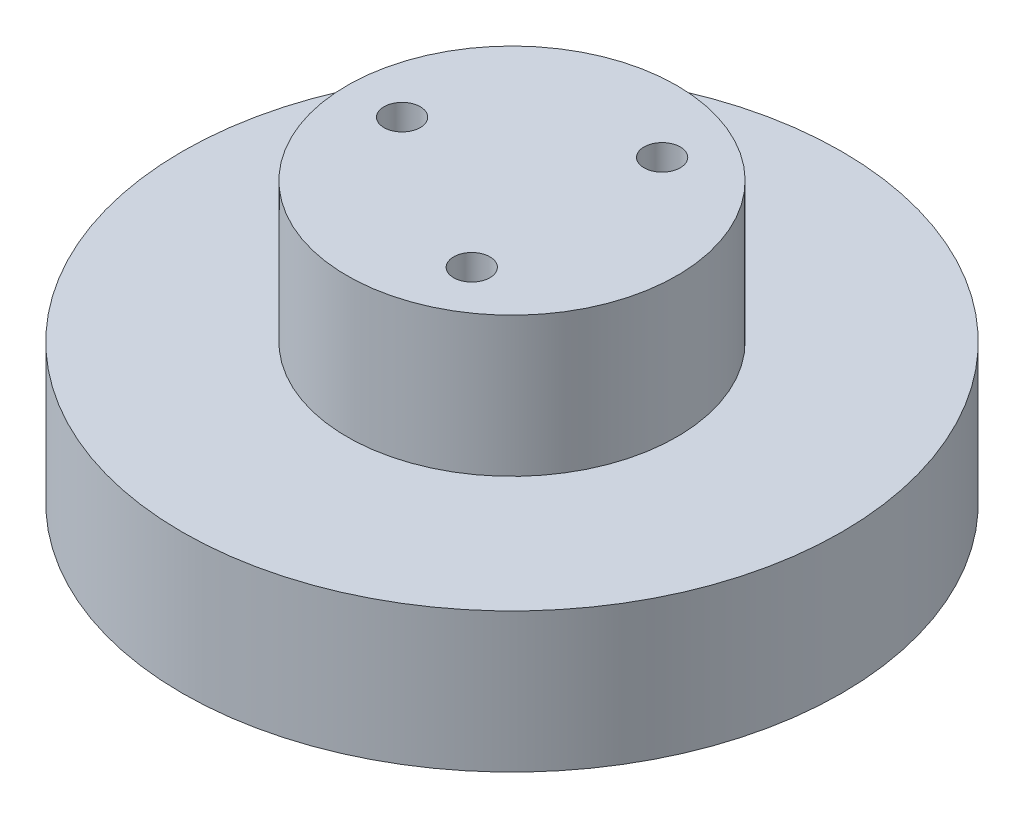
ISO-10303-21;
HEADER;
FILE_DESCRIPTION(('STEP AP214'),'2;1');
FILE_NAME('part.step','',(''),(''),'','','');
FILE_SCHEMA(('AUTOMOTIVE_DESIGN { 1 0 10303 214 1 1 1 1 }'));
ENDSEC;
DATA;
#1=APPLICATION_CONTEXT('core data for automotive mechanical design processes');
#2=APPLICATION_PROTOCOL_DEFINITION('international standard','automotive_design',2000,#1);
#3=PRODUCT_CONTEXT('',#1,'mechanical');
#4=PRODUCT('Part','Part','',(#3));
#5=PRODUCT_RELATED_PRODUCT_CATEGORY('part','',(#4));
#6=PRODUCT_DEFINITION_FORMATION('','',#4);
#7=PRODUCT_DEFINITION_CONTEXT('part definition',#1,'design');
#8=PRODUCT_DEFINITION('design','',#6,#7);
#9=PRODUCT_DEFINITION_SHAPE('','',#8);
#10=(LENGTH_UNIT() NAMED_UNIT(*) SI_UNIT(.MILLI.,.METRE.));
#11=(NAMED_UNIT(*) PLANE_ANGLE_UNIT() SI_UNIT($,.RADIAN.));
#12=(NAMED_UNIT(*) SI_UNIT($,.STERADIAN.) SOLID_ANGLE_UNIT());
#13=UNCERTAINTY_MEASURE_WITH_UNIT(LENGTH_MEASURE(1.E-05),#10,'distance_accuracy_value','');
#14=(GEOMETRIC_REPRESENTATION_CONTEXT(3) GLOBAL_UNCERTAINTY_ASSIGNED_CONTEXT((#13)) GLOBAL_UNIT_ASSIGNED_CONTEXT((#10,
#11,#12)) REPRESENTATION_CONTEXT('',''));
#15=CARTESIAN_POINT('',(0.,0.,0.));
#16=DIRECTION('',(0.,0.,1.));
#17=DIRECTION('',(1.,0.,0.));
#18=AXIS2_PLACEMENT_3D('',#15,#16,#17);
#19=CARTESIAN_POINT('',(0.,12.7,0.));
#20=DIRECTION('',(0.,-1.,0.));
#21=DIRECTION('',(0.,0.,-1.));
#22=AXIS2_PLACEMENT_3D('',#19,#20,#21);
#23=PLANE('',#22);
#24=CARTESIAN_POINT('',(4.99999999999998,12.7,-8.6602540378444));
#25=DIRECTION('',(0.,1.,0.));
#26=DIRECTION('',(0.,0.,1.));
#27=AXIS2_PLACEMENT_3D('',#24,#25,#26);
#28=CIRCLE('',#27,1.64999999999999);
#29=CARTESIAN_POINT('',(4.99999999999998,12.7,-7.01025403784441));
#30=VERTEX_POINT('',#29);
#31=EDGE_CURVE('E92',#30,#30,#28,.T.);
#32=ORIENTED_EDGE('',*,*,#31,.F.);
#33=EDGE_LOOP('',(#32));
#34=FACE_BOUND('',#33,.T.);
#35=CARTESIAN_POINT('',(5.00000000000004,12.7,8.66025403784436));
#36=DIRECTION('',(0.,1.,0.));
#37=DIRECTION('',(0.,0.,1.));
#38=AXIS2_PLACEMENT_3D('',#35,#36,#37);
#39=CIRCLE('',#38,1.64999999999999);
#40=CARTESIAN_POINT('',(5.00000000000004,12.7,10.3102540378444));
#41=VERTEX_POINT('',#40);
#42=EDGE_CURVE('E98',#41,#41,#39,.T.);
#43=ORIENTED_EDGE('',*,*,#42,.F.);
#44=EDGE_LOOP('',(#43));
#45=FACE_BOUND('',#44,.T.);
#46=CARTESIAN_POINT('',(-10.,12.7,0.));
#47=DIRECTION('',(0.,1.,0.));
#48=DIRECTION('',(0.,0.,1.));
#49=AXIS2_PLACEMENT_3D('',#46,#47,#48);
#50=CIRCLE('',#49,1.64999999999999);
#51=CARTESIAN_POINT('',(-10.,12.7,1.64999999999999));
#52=VERTEX_POINT('',#51);
#53=EDGE_CURVE('E104',#52,#52,#50,.T.);
#54=ORIENTED_EDGE('',*,*,#53,.F.);
#55=EDGE_LOOP('',(#54));
#56=FACE_BOUND('',#55,.T.);
#57=CARTESIAN_POINT('',(0.,12.7,0.));
#58=DIRECTION('',(0.,-1.,0.));
#59=DIRECTION('',(0.,0.,-1.));
#60=AXIS2_PLACEMENT_3D('',#57,#58,#59);
#61=CIRCLE('',#60,15.);
#62=CARTESIAN_POINT('',(0.,12.7,-15.));
#63=VERTEX_POINT('',#62);
#64=EDGE_CURVE('E11',#63,#63,#61,.T.);
#65=ORIENTED_EDGE('',*,*,#64,.F.);
#66=EDGE_LOOP('',(#65));
#67=FACE_BOUND('',#66,.T.);
#68=ADVANCED_FACE('F39',(#34,#45,#56,#67),#23,.F.);
#69=CARTESIAN_POINT('',(0.,-12.7,0.));
#70=DIRECTION('',(0.,-1.,0.));
#71=DIRECTION('',(0.,0.,-1.));
#72=AXIS2_PLACEMENT_3D('',#69,#70,#71);
#73=CYLINDRICAL_SURFACE('',#72,15.);
#74=CARTESIAN_POINT('',(0.,0.,0.));
#75=DIRECTION('',(0.,-1.,0.));
#76=DIRECTION('',(0.,0.,-1.));
#77=AXIS2_PLACEMENT_3D('',#74,#75,#76);
#78=CIRCLE('',#77,15.);
#79=CARTESIAN_POINT('',(0.,0.,-15.));
#80=VERTEX_POINT('',#79);
#81=EDGE_CURVE('E46',#80,#80,#78,.T.);
#82=ORIENTED_EDGE('',*,*,#81,.F.);
#83=EDGE_LOOP('',(#82));
#84=FACE_BOUND('',#83,.T.);
#85=ORIENTED_EDGE('',*,*,#64,.T.);
#86=EDGE_LOOP('',(#85));
#87=FACE_BOUND('',#86,.T.);
#88=ADVANCED_FACE('F120',(#84,#87),#73,.T.);
#89=CARTESIAN_POINT('',(-15.,0.,0.));
#90=DIRECTION('',(0.,-1.,0.));
#91=DIRECTION('',(0.,0.,-1.));
#92=AXIS2_PLACEMENT_3D('',#89,#90,#91);
#93=PLANE('',#92);
#94=CARTESIAN_POINT('',(0.,0.,0.));
#95=DIRECTION('',(0.,-1.,0.));
#96=DIRECTION('',(0.,0.,-1.));
#97=AXIS2_PLACEMENT_3D('',#94,#95,#96);
#98=CIRCLE('',#97,30.);
#99=CARTESIAN_POINT('',(0.,0.,-30.));
#100=VERTEX_POINT('',#99);
#101=EDGE_CURVE('E113',#100,#100,#98,.T.);
#102=ORIENTED_EDGE('',*,*,#101,.F.);
#103=EDGE_LOOP('',(#102));
#104=FACE_BOUND('',#103,.T.);
#105=ORIENTED_EDGE('',*,*,#81,.T.);
#106=EDGE_LOOP('',(#105));
#107=FACE_BOUND('',#106,.T.);
#108=ADVANCED_FACE('F118',(#104,#107),#93,.F.);
#109=CARTESIAN_POINT('',(0.,-12.7,0.));
#110=DIRECTION('',(0.,-1.,0.));
#111=DIRECTION('',(0.,0.,-1.));
#112=AXIS2_PLACEMENT_3D('',#109,#110,#111);
#113=CYLINDRICAL_SURFACE('',#112,30.);
#114=CARTESIAN_POINT('',(0.,-12.7,0.));
#115=DIRECTION('',(0.,-1.,0.));
#116=DIRECTION('',(0.,0.,-1.));
#117=AXIS2_PLACEMENT_3D('',#114,#115,#116);
#118=CIRCLE('',#117,30.);
#119=CARTESIAN_POINT('',(0.,-12.7,-30.));
#120=VERTEX_POINT('',#119);
#121=EDGE_CURVE('E110',#120,#120,#118,.T.);
#122=ORIENTED_EDGE('',*,*,#121,.F.);
#123=EDGE_LOOP('',(#122));
#124=FACE_BOUND('',#123,.T.);
#125=ORIENTED_EDGE('',*,*,#101,.T.);
#126=EDGE_LOOP('',(#125));
#127=FACE_BOUND('',#126,.T.);
#128=ADVANCED_FACE('F154',(#124,#127),#113,.T.);
#129=CARTESIAN_POINT('',(-30.,-12.7,0.));
#130=DIRECTION('',(0.,1.,0.));
#131=DIRECTION('',(0.,0.,1.));
#132=AXIS2_PLACEMENT_3D('',#129,#130,#131);
#133=PLANE('',#132);
#134=CARTESIAN_POINT('',(20.,-12.7,0.));
#135=DIRECTION('',(0.,-1.,0.));
#136=DIRECTION('',(0.,0.,-1.));
#137=AXIS2_PLACEMENT_3D('',#134,#135,#136);
#138=CIRCLE('',#137,1.64999999999999);
#139=CARTESIAN_POINT('',(20.,-12.7,-1.64999999999999));
#140=VERTEX_POINT('',#139);
#141=EDGE_CURVE('E76',#140,#140,#138,.T.);
#142=ORIENTED_EDGE('',*,*,#141,.F.);
#143=EDGE_LOOP('',(#142));
#144=FACE_BOUND('',#143,.T.);
#145=CARTESIAN_POINT('',(-9.99999999999996,-12.7,17.3205080756888));
#146=DIRECTION('',(0.,-1.,0.));
#147=DIRECTION('',(0.,0.,-1.));
#148=AXIS2_PLACEMENT_3D('',#145,#146,#147);
#149=CIRCLE('',#148,1.64999999999999);
#150=CARTESIAN_POINT('',(-9.99999999999996,-12.7,15.6705080756888));
#151=VERTEX_POINT('',#150);
#152=EDGE_CURVE('E75',#151,#151,#149,.T.);
#153=ORIENTED_EDGE('',*,*,#152,.F.);
#154=EDGE_LOOP('',(#153));
#155=FACE_BOUND('',#154,.T.);
#156=CARTESIAN_POINT('',(-9.99999999999996,-12.7,-17.3205080756888));
#157=DIRECTION('',(0.,-1.,0.));
#158=DIRECTION('',(0.,0.,-1.));
#159=AXIS2_PLACEMENT_3D('',#156,#157,#158);
#160=CIRCLE('',#159,1.64999999999999);
#161=CARTESIAN_POINT('',(-9.99999999999996,-12.7,-18.9705080756888));
#162=VERTEX_POINT('',#161);
#163=EDGE_CURVE('E86',#162,#162,#160,.T.);
#164=ORIENTED_EDGE('',*,*,#163,.F.);
#165=EDGE_LOOP('',(#164));
#166=FACE_BOUND('',#165,.T.);
#167=ORIENTED_EDGE('',*,*,#121,.T.);
#168=EDGE_LOOP('',(#167));
#169=FACE_BOUND('',#168,.T.);
#170=ADVANCED_FACE('F147',(#144,#155,#166,#169),#133,.F.);
#171=CARTESIAN_POINT('',(-10.,2.6,0.));
#172=DIRECTION('',(0.,1.,0.));
#173=DIRECTION('',(0.,0.,1.));
#174=AXIS2_PLACEMENT_3D('',#171,#172,#173);
#175=CONICAL_SURFACE('',#174,1.64999999999999,1.02974425867665);
#176=CARTESIAN_POINT('',(-10.,1.60857997860452,0.));
#177=VERTEX_POINT('',#176);
#178=VERTEX_LOOP('',#177);
#179=FACE_BOUND('',#178,.T.);
#180=CARTESIAN_POINT('',(-10.,2.6,0.));
#181=DIRECTION('',(0.,1.,0.));
#182=DIRECTION('',(0.,0.,1.));
#183=AXIS2_PLACEMENT_3D('',#180,#181,#182);
#184=CIRCLE('',#183,1.64999999999999);
#185=CARTESIAN_POINT('',(-10.,2.6,1.64999999999999));
#186=VERTEX_POINT('',#185);
#187=EDGE_CURVE('E107',#186,#186,#184,.T.);
#188=ORIENTED_EDGE('',*,*,#187,.T.);
#189=EDGE_LOOP('',(#188));
#190=FACE_BOUND('',#189,.T.);
#191=ADVANCED_FACE('F138',(#179,#190),#175,.F.);
#192=CARTESIAN_POINT('',(-10.,12.7,0.));
#193=DIRECTION('',(0.,1.,0.));
#194=DIRECTION('',(0.,0.,1.));
#195=AXIS2_PLACEMENT_3D('',#192,#193,#194);
#196=CYLINDRICAL_SURFACE('',#195,1.64999999999999);
#197=ORIENTED_EDGE('',*,*,#187,.F.);
#198=EDGE_LOOP('',(#197));
#199=FACE_BOUND('',#198,.T.);
#200=ORIENTED_EDGE('',*,*,#53,.T.);
#201=EDGE_LOOP('',(#200));
#202=FACE_BOUND('',#201,.T.);
#203=ADVANCED_FACE('F135',(#199,#202),#196,.F.);
#204=CARTESIAN_POINT('',(5.00000000000004,2.6,8.66025403784436));
#205=DIRECTION('',(0.,1.,0.));
#206=DIRECTION('',(0.,0.,1.));
#207=AXIS2_PLACEMENT_3D('',#204,#205,#206);
#208=CONICAL_SURFACE('',#207,1.64999999999999,1.02974425867665);
#209=CARTESIAN_POINT('',(5.00000000000004,1.60857997860452,8.66025403784436));
#210=VERTEX_POINT('',#209);
#211=VERTEX_LOOP('',#210);
#212=FACE_BOUND('',#211,.T.);
#213=CARTESIAN_POINT('',(5.00000000000004,2.6,8.66025403784436));
#214=DIRECTION('',(0.,1.,0.));
#215=DIRECTION('',(0.,0.,1.));
#216=AXIS2_PLACEMENT_3D('',#213,#214,#215);
#217=CIRCLE('',#216,1.64999999999999);
#218=CARTESIAN_POINT('',(5.00000000000004,2.6,10.3102540378444));
#219=VERTEX_POINT('',#218);
#220=EDGE_CURVE('E101',#219,#219,#217,.T.);
#221=ORIENTED_EDGE('',*,*,#220,.T.);
#222=EDGE_LOOP('',(#221));
#223=FACE_BOUND('',#222,.T.);
#224=ADVANCED_FACE('F137',(#212,#223),#208,.F.);
#225=CARTESIAN_POINT('',(5.00000000000004,12.7,8.66025403784436));
#226=DIRECTION('',(0.,1.,0.));
#227=DIRECTION('',(0.,0.,1.));
#228=AXIS2_PLACEMENT_3D('',#225,#226,#227);
#229=CYLINDRICAL_SURFACE('',#228,1.64999999999999);
#230=ORIENTED_EDGE('',*,*,#220,.F.);
#231=EDGE_LOOP('',(#230));
#232=FACE_BOUND('',#231,.T.);
#233=ORIENTED_EDGE('',*,*,#42,.T.);
#234=EDGE_LOOP('',(#233));
#235=FACE_BOUND('',#234,.T.);
#236=ADVANCED_FACE('F145',(#232,#235),#229,.F.);
#237=CARTESIAN_POINT('',(4.99999999999998,2.6,-8.6602540378444));
#238=DIRECTION('',(0.,1.,0.));
#239=DIRECTION('',(0.,0.,1.));
#240=AXIS2_PLACEMENT_3D('',#237,#238,#239);
#241=CONICAL_SURFACE('',#240,1.64999999999999,1.02974425867665);
#242=CARTESIAN_POINT('',(4.99999999999998,1.60857997860452,-8.6602540378444));
#243=VERTEX_POINT('',#242);
#244=VERTEX_LOOP('',#243);
#245=FACE_BOUND('',#244,.T.);
#246=CARTESIAN_POINT('',(4.99999999999998,2.6,-8.6602540378444));
#247=DIRECTION('',(0.,1.,0.));
#248=DIRECTION('',(0.,0.,1.));
#249=AXIS2_PLACEMENT_3D('',#246,#247,#248);
#250=CIRCLE('',#249,1.64999999999999);
#251=CARTESIAN_POINT('',(4.99999999999998,2.6,-7.01025403784441));
#252=VERTEX_POINT('',#251);
#253=EDGE_CURVE('E95',#252,#252,#250,.T.);
#254=ORIENTED_EDGE('',*,*,#253,.T.);
#255=EDGE_LOOP('',(#254));
#256=FACE_BOUND('',#255,.T.);
#257=ADVANCED_FACE('F210',(#245,#256),#241,.F.);
#258=CARTESIAN_POINT('',(4.99999999999998,12.7,-8.6602540378444));
#259=DIRECTION('',(0.,1.,0.));
#260=DIRECTION('',(0.,0.,1.));
#261=AXIS2_PLACEMENT_3D('',#258,#259,#260);
#262=CYLINDRICAL_SURFACE('',#261,1.64999999999999);
#263=ORIENTED_EDGE('',*,*,#253,.F.);
#264=EDGE_LOOP('',(#263));
#265=FACE_BOUND('',#264,.T.);
#266=ORIENTED_EDGE('',*,*,#31,.T.);
#267=EDGE_LOOP('',(#266));
#268=FACE_BOUND('',#267,.T.);
#269=ADVANCED_FACE('F220',(#265,#268),#262,.F.);
#270=CARTESIAN_POINT('',(-9.99999999999996,-2.6,-17.3205080756888));
#271=DIRECTION('',(0.,-1.,0.));
#272=DIRECTION('',(0.,0.,-1.));
#273=AXIS2_PLACEMENT_3D('',#270,#271,#272);
#274=CONICAL_SURFACE('',#273,1.64999999999999,1.02974425867665);
#275=CARTESIAN_POINT('',(-9.99999999999996,-1.60857997860452,-17.3205080756888));
#276=VERTEX_POINT('',#275);
#277=VERTEX_LOOP('',#276);
#278=FACE_BOUND('',#277,.T.);
#279=CARTESIAN_POINT('',(-9.99999999999996,-2.6,-17.3205080756888));
#280=DIRECTION('',(0.,-1.,0.));
#281=DIRECTION('',(0.,0.,-1.));
#282=AXIS2_PLACEMENT_3D('',#279,#280,#281);
#283=CIRCLE('',#282,1.64999999999999);
#284=CARTESIAN_POINT('',(-9.99999999999996,-2.6,-18.9705080756888));
#285=VERTEX_POINT('',#284);
#286=EDGE_CURVE('E89',#285,#285,#283,.T.);
#287=ORIENTED_EDGE('',*,*,#286,.T.);
#288=EDGE_LOOP('',(#287));
#289=FACE_BOUND('',#288,.T.);
#290=ADVANCED_FACE('F230',(#278,#289),#274,.F.);
#291=CARTESIAN_POINT('',(-9.99999999999996,-12.7,-17.3205080756888));
#292=DIRECTION('',(0.,-1.,0.));
#293=DIRECTION('',(0.,0.,-1.));
#294=AXIS2_PLACEMENT_3D('',#291,#292,#293);
#295=CYLINDRICAL_SURFACE('',#294,1.64999999999999);
#296=ORIENTED_EDGE('',*,*,#286,.F.);
#297=EDGE_LOOP('',(#296));
#298=FACE_BOUND('',#297,.T.);
#299=ORIENTED_EDGE('',*,*,#163,.T.);
#300=EDGE_LOOP('',(#299));
#301=FACE_BOUND('',#300,.T.);
#302=ADVANCED_FACE('F252',(#298,#301),#295,.F.);
#303=CARTESIAN_POINT('',(-9.99999999999996,-2.6,17.3205080756888));
#304=DIRECTION('',(0.,-1.,0.));
#305=DIRECTION('',(0.,0.,-1.));
#306=AXIS2_PLACEMENT_3D('',#303,#304,#305);
#307=CONICAL_SURFACE('',#306,1.64999999999999,1.02974425867665);
#308=CARTESIAN_POINT('',(-9.99999999999996,-1.60857997860452,17.3205080756888));
#309=VERTEX_POINT('',#308);
#310=VERTEX_LOOP('',#309);
#311=FACE_BOUND('',#310,.T.);
#312=CARTESIAN_POINT('',(-9.99999999999996,-2.6,17.3205080756888));
#313=DIRECTION('',(0.,-1.,0.));
#314=DIRECTION('',(0.,0.,-1.));
#315=AXIS2_PLACEMENT_3D('',#312,#313,#314);
#316=CIRCLE('',#315,1.64999999999999);
#317=CARTESIAN_POINT('',(-9.99999999999996,-2.6,15.6705080756888));
#318=VERTEX_POINT('',#317);
#319=EDGE_CURVE('E79',#318,#318,#316,.T.);
#320=ORIENTED_EDGE('',*,*,#319,.T.);
#321=EDGE_LOOP('',(#320));
#322=FACE_BOUND('',#321,.T.);
#323=ADVANCED_FACE('F262',(#311,#322),#307,.F.);
#324=CARTESIAN_POINT('',(-9.99999999999996,-12.7,17.3205080756888));
#325=DIRECTION('',(0.,-1.,0.));
#326=DIRECTION('',(0.,0.,-1.));
#327=AXIS2_PLACEMENT_3D('',#324,#325,#326);
#328=CYLINDRICAL_SURFACE('',#327,1.64999999999999);
#329=ORIENTED_EDGE('',*,*,#319,.F.);
#330=EDGE_LOOP('',(#329));
#331=FACE_BOUND('',#330,.T.);
#332=ORIENTED_EDGE('',*,*,#152,.T.);
#333=EDGE_LOOP('',(#332));
#334=FACE_BOUND('',#333,.T.);
#335=ADVANCED_FACE('F69',(#331,#334),#328,.F.);
#336=CARTESIAN_POINT('',(20.,-2.6,0.));
#337=DIRECTION('',(0.,-1.,0.));
#338=DIRECTION('',(0.,0.,-1.));
#339=AXIS2_PLACEMENT_3D('',#336,#337,#338);
#340=CONICAL_SURFACE('',#339,1.64999999999999,1.02974425867665);
#341=CARTESIAN_POINT('',(20.,-1.60857997860452,0.));
#342=VERTEX_POINT('',#341);
#343=VERTEX_LOOP('',#342);
#344=FACE_BOUND('',#343,.T.);
#345=CARTESIAN_POINT('',(20.,-2.6,0.));
#346=DIRECTION('',(0.,-1.,0.));
#347=DIRECTION('',(0.,0.,-1.));
#348=AXIS2_PLACEMENT_3D('',#345,#346,#347);
#349=CIRCLE('',#348,1.64999999999999);
#350=CARTESIAN_POINT('',(20.,-2.6,-1.64999999999999));
#351=VERTEX_POINT('',#350);
#352=EDGE_CURVE('E73',#351,#351,#349,.T.);
#353=ORIENTED_EDGE('',*,*,#352,.T.);
#354=EDGE_LOOP('',(#353));
#355=FACE_BOUND('',#354,.T.);
#356=ADVANCED_FACE('F65',(#344,#355),#340,.F.);
#357=CARTESIAN_POINT('',(20.,-12.7,0.));
#358=DIRECTION('',(0.,-1.,0.));
#359=DIRECTION('',(0.,0.,-1.));
#360=AXIS2_PLACEMENT_3D('',#357,#358,#359);
#361=CYLINDRICAL_SURFACE('',#360,1.64999999999999);
#362=ORIENTED_EDGE('',*,*,#352,.F.);
#363=EDGE_LOOP('',(#362));
#364=FACE_BOUND('',#363,.T.);
#365=ORIENTED_EDGE('',*,*,#141,.T.);
#366=EDGE_LOOP('',(#365));
#367=FACE_BOUND('',#366,.T.);
#368=ADVANCED_FACE('F68',(#364,#367),#361,.F.);
#369=CLOSED_SHELL('',(#68,#88,#108,#128,#170,#191,#203,#224,#236,#257,#269,#290,#302,#323,#335,
#356,#368));
#370=MANIFOLD_SOLID_BREP('B2',#369);
#371=ADVANCED_BREP_SHAPE_REPRESENTATION('',(#18,#370),#14);
#372=SHAPE_DEFINITION_REPRESENTATION(#9,#371);
ENDSEC;
END-ISO-10303-21;
